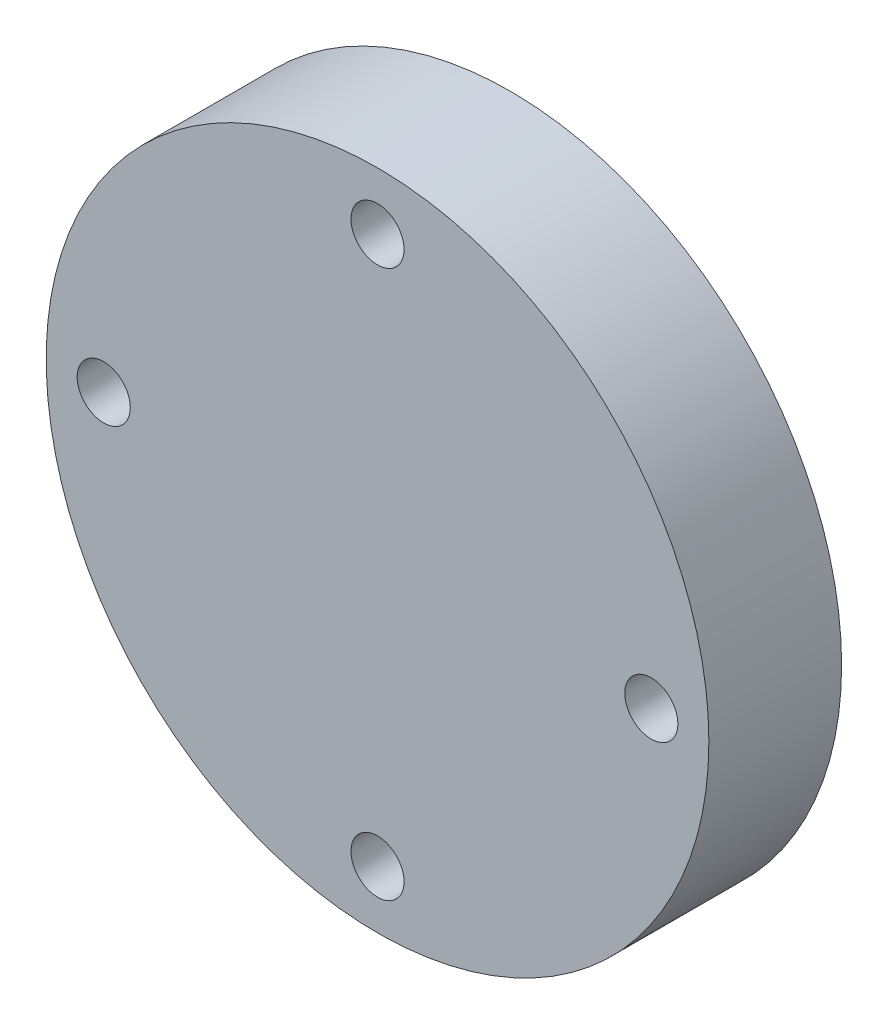
ISO-10303-21;
HEADER;
FILE_DESCRIPTION(('STEP AP214'),'2;1');
FILE_NAME('part.step','',(''),(''),'','','');
FILE_SCHEMA(('AUTOMOTIVE_DESIGN { 1 0 10303 214 1 1 1 1 }'));
ENDSEC;
DATA;
#1=APPLICATION_CONTEXT('core data for automotive mechanical design processes');
#2=APPLICATION_PROTOCOL_DEFINITION('international standard','automotive_design',2000,#1);
#3=PRODUCT_CONTEXT('',#1,'mechanical');
#4=PRODUCT('Part','Part','',(#3));
#5=PRODUCT_RELATED_PRODUCT_CATEGORY('part','',(#4));
#6=PRODUCT_DEFINITION_FORMATION('','',#4);
#7=PRODUCT_DEFINITION_CONTEXT('part definition',#1,'design');
#8=PRODUCT_DEFINITION('design','',#6,#7);
#9=PRODUCT_DEFINITION_SHAPE('','',#8);
#10=(LENGTH_UNIT() NAMED_UNIT(*) SI_UNIT(.MILLI.,.METRE.));
#11=(NAMED_UNIT(*) PLANE_ANGLE_UNIT() SI_UNIT($,.RADIAN.));
#12=(NAMED_UNIT(*) SI_UNIT($,.STERADIAN.) SOLID_ANGLE_UNIT());
#13=UNCERTAINTY_MEASURE_WITH_UNIT(LENGTH_MEASURE(1.E-05),#10,'distance_accuracy_value','');
#14=(GEOMETRIC_REPRESENTATION_CONTEXT(3) GLOBAL_UNCERTAINTY_ASSIGNED_CONTEXT((#13)) GLOBAL_UNIT_ASSIGNED_CONTEXT((#10,
#11,#12)) REPRESENTATION_CONTEXT('',''));
#15=CARTESIAN_POINT('',(0.,0.,0.));
#16=DIRECTION('',(0.,0.,1.));
#17=DIRECTION('',(1.,0.,0.));
#18=AXIS2_PLACEMENT_3D('',#15,#16,#17);
#19=CARTESIAN_POINT('',(0.,0.,8.));
#20=DIRECTION('',(0.,0.,1.));
#21=DIRECTION('',(1.,0.,0.));
#22=AXIS2_PLACEMENT_3D('',#19,#20,#21);
#23=PLANE('',#22);
#24=CARTESIAN_POINT('',(0.,16.5,8.));
#25=DIRECTION('',(0.,0.,1.));
#26=DIRECTION('',(1.,0.,0.));
#27=AXIS2_PLACEMENT_3D('',#24,#25,#26);
#28=CIRCLE('',#27,1.6);
#29=CARTESIAN_POINT('',(1.60000000000006,16.5,8.));
#30=VERTEX_POINT('',#29);
#31=EDGE_CURVE('E53',#30,#30,#28,.T.);
#32=ORIENTED_EDGE('',*,*,#31,.F.);
#33=EDGE_LOOP('',(#32));
#34=FACE_BOUND('',#33,.T.);
#35=CARTESIAN_POINT('',(-1.72835194828872E-13,-16.5,8.));
#36=DIRECTION('',(0.,0.,1.));
#37=DIRECTION('',(1.,0.,0.));
#38=AXIS2_PLACEMENT_3D('',#35,#36,#37);
#39=CIRCLE('',#38,1.6);
#40=CARTESIAN_POINT('',(1.59999999999983,-16.5,8.));
#41=VERTEX_POINT('',#40);
#42=EDGE_CURVE('E42',#41,#41,#39,.T.);
#43=ORIENTED_EDGE('',*,*,#42,.F.);
#44=EDGE_LOOP('',(#43));
#45=FACE_BOUND('',#44,.T.);
#46=CARTESIAN_POINT('',(0.,0.,8.));
#47=DIRECTION('',(0.,0.,1.));
#48=DIRECTION('',(1.,0.,0.));
#49=AXIS2_PLACEMENT_3D('',#46,#47,#48);
#50=CIRCLE('',#49,19.9686269665969);
#51=CARTESIAN_POINT('',(19.9686269665969,0.,8.));
#52=VERTEX_POINT('',#51);
#53=EDGE_CURVE('E10',#52,#52,#50,.T.);
#54=ORIENTED_EDGE('',*,*,#53,.T.);
#55=EDGE_LOOP('',(#54));
#56=FACE_BOUND('',#55,.T.);
#57=CARTESIAN_POINT('',(-16.5,0.,8.));
#58=DIRECTION('',(0.,0.,1.));
#59=DIRECTION('',(1.,0.,0.));
#60=AXIS2_PLACEMENT_3D('',#57,#58,#59);
#61=CIRCLE('',#60,1.6);
#62=CARTESIAN_POINT('',(-14.9,0.,8.));
#63=VERTEX_POINT('',#62);
#64=EDGE_CURVE('E47',#63,#63,#61,.T.);
#65=ORIENTED_EDGE('',*,*,#64,.F.);
#66=EDGE_LOOP('',(#65));
#67=FACE_BOUND('',#66,.T.);
#68=CARTESIAN_POINT('',(16.5,-1.15440928786748E-13,8.));
#69=DIRECTION('',(0.,0.,1.));
#70=DIRECTION('',(1.,0.,0.));
#71=AXIS2_PLACEMENT_3D('',#68,#69,#70);
#72=CIRCLE('',#71,1.6);
#73=CARTESIAN_POINT('',(18.1,-1.15440928786748E-13,8.));
#74=VERTEX_POINT('',#73);
#75=EDGE_CURVE('E59',#74,#74,#72,.T.);
#76=ORIENTED_EDGE('',*,*,#75,.F.);
#77=EDGE_LOOP('',(#76));
#78=FACE_BOUND('',#77,.T.);
#79=ADVANCED_FACE('F31',(#34,#45,#56,#67,#78),#23,.T.);
#80=CARTESIAN_POINT('',(0.,0.,0.));
#81=DIRECTION('',(0.,0.,1.));
#82=DIRECTION('',(1.,0.,0.));
#83=AXIS2_PLACEMENT_3D('',#80,#81,#82);
#84=PLANE('',#83);
#85=CARTESIAN_POINT('',(0.,0.,0.));
#86=DIRECTION('',(0.,0.,1.));
#87=DIRECTION('',(1.,0.,0.));
#88=AXIS2_PLACEMENT_3D('',#85,#86,#87);
#89=CIRCLE('',#88,19.9686269665969);
#90=CARTESIAN_POINT('',(19.9686269665969,0.,0.));
#91=VERTEX_POINT('',#90);
#92=EDGE_CURVE('E35',#91,#91,#89,.T.);
#93=ORIENTED_EDGE('',*,*,#92,.F.);
#94=EDGE_LOOP('',(#93));
#95=FACE_BOUND('',#94,.T.);
#96=CARTESIAN_POINT('',(-1.72835194828872E-13,-16.5,0.));
#97=DIRECTION('',(0.,0.,1.));
#98=DIRECTION('',(1.,0.,0.));
#99=AXIS2_PLACEMENT_3D('',#96,#97,#98);
#100=CIRCLE('',#99,1.6);
#101=CARTESIAN_POINT('',(1.59999999999983,-16.5,0.));
#102=VERTEX_POINT('',#101);
#103=EDGE_CURVE('E44',#102,#102,#100,.T.);
#104=ORIENTED_EDGE('',*,*,#103,.T.);
#105=EDGE_LOOP('',(#104));
#106=FACE_BOUND('',#105,.T.);
#107=CARTESIAN_POINT('',(-16.5,0.,0.));
#108=DIRECTION('',(0.,0.,1.));
#109=DIRECTION('',(1.,0.,0.));
#110=AXIS2_PLACEMENT_3D('',#107,#108,#109);
#111=CIRCLE('',#110,1.6);
#112=CARTESIAN_POINT('',(-14.9,0.,0.));
#113=VERTEX_POINT('',#112);
#114=EDGE_CURVE('E50',#113,#113,#111,.T.);
#115=ORIENTED_EDGE('',*,*,#114,.T.);
#116=EDGE_LOOP('',(#115));
#117=FACE_BOUND('',#116,.T.);
#118=CARTESIAN_POINT('',(0.,16.5,0.));
#119=DIRECTION('',(0.,0.,1.));
#120=DIRECTION('',(1.,0.,0.));
#121=AXIS2_PLACEMENT_3D('',#118,#119,#120);
#122=CIRCLE('',#121,1.6);
#123=CARTESIAN_POINT('',(1.60000000000006,16.5,0.));
#124=VERTEX_POINT('',#123);
#125=EDGE_CURVE('E56',#124,#124,#122,.T.);
#126=ORIENTED_EDGE('',*,*,#125,.T.);
#127=EDGE_LOOP('',(#126));
#128=FACE_BOUND('',#127,.T.);
#129=CARTESIAN_POINT('',(16.5,-1.15440928786748E-13,0.));
#130=DIRECTION('',(0.,0.,1.));
#131=DIRECTION('',(1.,0.,0.));
#132=AXIS2_PLACEMENT_3D('',#129,#130,#131);
#133=CIRCLE('',#132,1.6);
#134=CARTESIAN_POINT('',(18.1,-1.15440928786748E-13,0.));
#135=VERTEX_POINT('',#134);
#136=EDGE_CURVE('E62',#135,#135,#133,.T.);
#137=ORIENTED_EDGE('',*,*,#136,.T.);
#138=EDGE_LOOP('',(#137));
#139=FACE_BOUND('',#138,.T.);
#140=ADVANCED_FACE('F72',(#95,#106,#117,#128,#139),#84,.F.);
#141=CARTESIAN_POINT('',(0.,0.,8.));
#142=DIRECTION('',(0.,0.,-1.));
#143=DIRECTION('',(-1.,0.,0.));
#144=AXIS2_PLACEMENT_3D('',#141,#142,#143);
#145=CYLINDRICAL_SURFACE('',#144,19.9686269665969);
#146=ORIENTED_EDGE('',*,*,#53,.F.);
#147=EDGE_LOOP('',(#146));
#148=FACE_BOUND('',#147,.T.);
#149=ORIENTED_EDGE('',*,*,#92,.T.);
#150=EDGE_LOOP('',(#149));
#151=FACE_BOUND('',#150,.T.);
#152=ADVANCED_FACE('F33',(#148,#151),#145,.T.);
#153=CARTESIAN_POINT('',(-1.72835194828872E-13,-16.5,8.));
#154=DIRECTION('',(0.,0.,-1.));
#155=DIRECTION('',(-1.,0.,0.));
#156=AXIS2_PLACEMENT_3D('',#153,#154,#155);
#157=CYLINDRICAL_SURFACE('',#156,1.6);
#158=ORIENTED_EDGE('',*,*,#42,.T.);
#159=EDGE_LOOP('',(#158));
#160=FACE_BOUND('',#159,.T.);
#161=ORIENTED_EDGE('',*,*,#103,.F.);
#162=EDGE_LOOP('',(#161));
#163=FACE_BOUND('',#162,.T.);
#164=ADVANCED_FACE('F82',(#160,#163),#157,.F.);
#165=CARTESIAN_POINT('',(-16.5,0.,8.));
#166=DIRECTION('',(0.,0.,-1.));
#167=DIRECTION('',(-1.,0.,0.));
#168=AXIS2_PLACEMENT_3D('',#165,#166,#167);
#169=CYLINDRICAL_SURFACE('',#168,1.6);
#170=ORIENTED_EDGE('',*,*,#64,.T.);
#171=EDGE_LOOP('',(#170));
#172=FACE_BOUND('',#171,.T.);
#173=ORIENTED_EDGE('',*,*,#114,.F.);
#174=EDGE_LOOP('',(#173));
#175=FACE_BOUND('',#174,.T.);
#176=ADVANCED_FACE('F85',(#172,#175),#169,.F.);
#177=CARTESIAN_POINT('',(0.,16.5,8.));
#178=DIRECTION('',(0.,0.,-1.));
#179=DIRECTION('',(-1.,0.,0.));
#180=AXIS2_PLACEMENT_3D('',#177,#178,#179);
#181=CYLINDRICAL_SURFACE('',#180,1.6);
#182=ORIENTED_EDGE('',*,*,#31,.T.);
#183=EDGE_LOOP('',(#182));
#184=FACE_BOUND('',#183,.T.);
#185=ORIENTED_EDGE('',*,*,#125,.F.);
#186=EDGE_LOOP('',(#185));
#187=FACE_BOUND('',#186,.T.);
#188=ADVANCED_FACE('F89',(#184,#187),#181,.F.);
#189=CARTESIAN_POINT('',(16.5,-1.15440928786748E-13,8.));
#190=DIRECTION('',(0.,0.,-1.));
#191=DIRECTION('',(-1.,0.,0.));
#192=AXIS2_PLACEMENT_3D('',#189,#190,#191);
#193=CYLINDRICAL_SURFACE('',#192,1.6);
#194=ORIENTED_EDGE('',*,*,#75,.T.);
#195=EDGE_LOOP('',(#194));
#196=FACE_BOUND('',#195,.T.);
#197=ORIENTED_EDGE('',*,*,#136,.F.);
#198=EDGE_LOOP('',(#197));
#199=FACE_BOUND('',#198,.T.);
#200=ADVANCED_FACE('F68',(#196,#199),#193,.F.);
#201=CLOSED_SHELL('',(#79,#140,#152,#164,#176,#188,#200));
#202=MANIFOLD_SOLID_BREP('B2',#201);
#203=ADVANCED_BREP_SHAPE_REPRESENTATION('',(#18,#202),#14);
#204=SHAPE_DEFINITION_REPRESENTATION(#9,#203);
ENDSEC;
END-ISO-10303-21;
